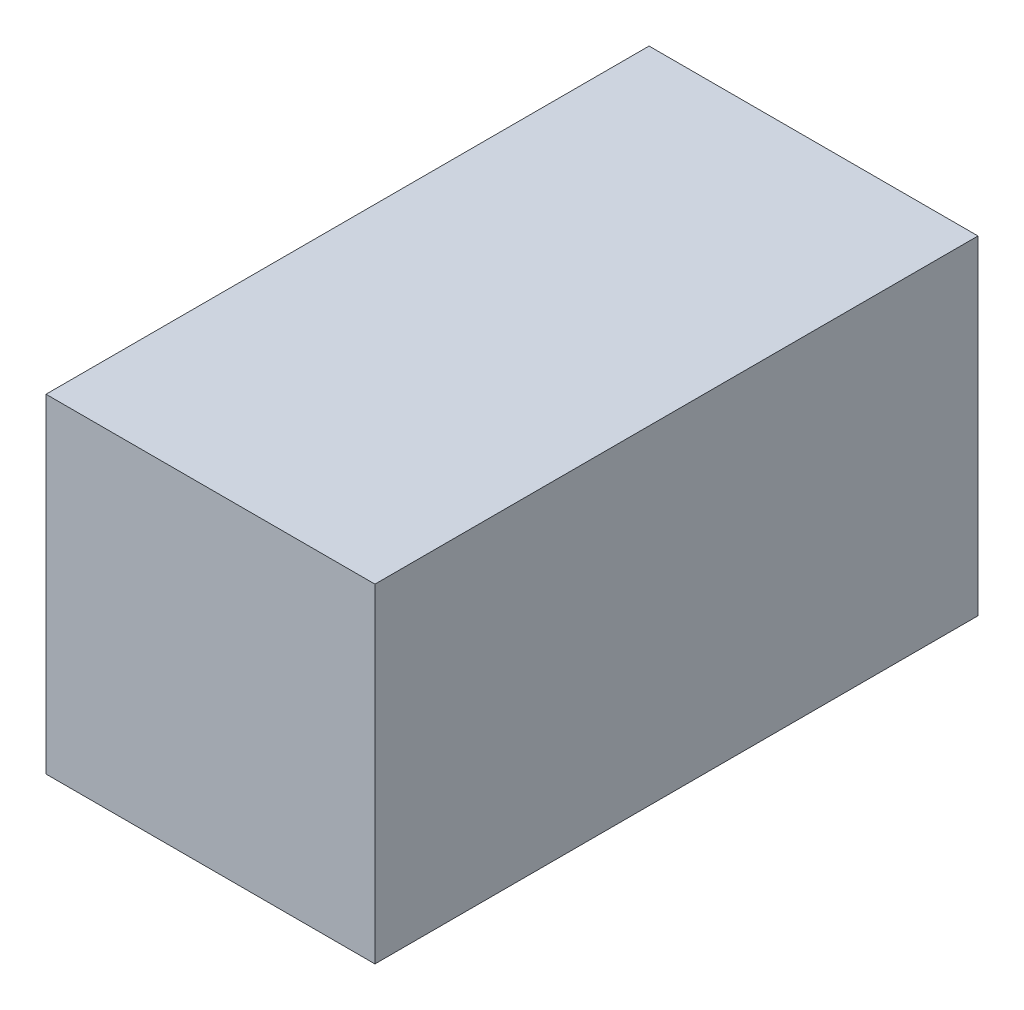
ISO-10303-21;
HEADER;
FILE_DESCRIPTION(('STEP AP214'),'2;1');
FILE_NAME('part.step','',(''),(''),'','','');
FILE_SCHEMA(('AUTOMOTIVE_DESIGN { 1 0 10303 214 1 1 1 1 }'));
ENDSEC;
DATA;
#1=APPLICATION_CONTEXT('core data for automotive mechanical design processes');
#2=APPLICATION_PROTOCOL_DEFINITION('international standard','automotive_design',2000,#1);
#3=PRODUCT_CONTEXT('',#1,'mechanical');
#4=PRODUCT('Part','Part','',(#3));
#5=PRODUCT_RELATED_PRODUCT_CATEGORY('part','',(#4));
#6=PRODUCT_DEFINITION_FORMATION('','',#4);
#7=PRODUCT_DEFINITION_CONTEXT('part definition',#1,'design');
#8=PRODUCT_DEFINITION('design','',#6,#7);
#9=PRODUCT_DEFINITION_SHAPE('','',#8);
#10=(LENGTH_UNIT() NAMED_UNIT(*) SI_UNIT(.MILLI.,.METRE.));
#11=(NAMED_UNIT(*) PLANE_ANGLE_UNIT() SI_UNIT($,.RADIAN.));
#12=(NAMED_UNIT(*) SI_UNIT($,.STERADIAN.) SOLID_ANGLE_UNIT());
#13=UNCERTAINTY_MEASURE_WITH_UNIT(LENGTH_MEASURE(1.E-05),#10,'distance_accuracy_value','');
#14=(GEOMETRIC_REPRESENTATION_CONTEXT(3) GLOBAL_UNCERTAINTY_ASSIGNED_CONTEXT((#13)) GLOBAL_UNIT_ASSIGNED_CONTEXT((#10,
#11,#12)) REPRESENTATION_CONTEXT('',''));
#15=CARTESIAN_POINT('',(0.,0.,0.));
#16=DIRECTION('',(0.,0.,1.));
#17=DIRECTION('',(1.,0.,0.));
#18=AXIS2_PLACEMENT_3D('',#15,#16,#17);
#19=CARTESIAN_POINT('',(0.,0.,139.7));
#20=DIRECTION('',(1.,0.,0.));
#21=DIRECTION('',(0.,0.,-1.));
#22=AXIS2_PLACEMENT_3D('',#19,#20,#21);
#23=PLANE('',#22);
#24=DIRECTION('',(0.,-1.,0.));
#25=VECTOR('',#24,1.);
#26=CARTESIAN_POINT('',(0.,0.,0.));
#27=LINE('',#26,#25);
#28=CARTESIAN_POINT('',(0.,76.2,0.));
#29=VERTEX_POINT('',#28);
#30=CARTESIAN_POINT('',(0.,0.,0.));
#31=VERTEX_POINT('',#30);
#32=EDGE_CURVE('E100',#29,#31,#27,.T.);
#33=ORIENTED_EDGE('',*,*,#32,.T.);
#34=DIRECTION('',(0.,0.,-1.));
#35=VECTOR('',#34,1.);
#36=CARTESIAN_POINT('',(0.,0.,139.7));
#37=LINE('',#36,#35);
#38=CARTESIAN_POINT('',(0.,0.,139.7));
#39=VERTEX_POINT('',#38);
#40=EDGE_CURVE('E11',#39,#31,#37,.T.);
#41=ORIENTED_EDGE('',*,*,#40,.F.);
#42=DIRECTION('',(0.,-1.,0.));
#43=VECTOR('',#42,1.);
#44=CARTESIAN_POINT('',(0.,0.,139.7));
#45=LINE('',#44,#43);
#46=CARTESIAN_POINT('',(0.,76.2,139.7));
#47=VERTEX_POINT('',#46);
#48=EDGE_CURVE('E88',#47,#39,#45,.T.);
#49=ORIENTED_EDGE('',*,*,#48,.F.);
#50=DIRECTION('',(0.,0.,-1.));
#51=VECTOR('',#50,1.);
#52=CARTESIAN_POINT('',(0.,76.2,139.7));
#53=LINE('',#52,#51);
#54=EDGE_CURVE('E96',#47,#29,#53,.T.);
#55=ORIENTED_EDGE('',*,*,#54,.T.);
#56=EDGE_LOOP('',(#33,#41,#49,#55));
#57=FACE_BOUND('',#56,.T.);
#58=ADVANCED_FACE('F37',(#57),#23,.F.);
#59=CARTESIAN_POINT('',(0.,0.,139.7));
#60=DIRECTION('',(0.,1.,0.));
#61=DIRECTION('',(0.,0.,1.));
#62=AXIS2_PLACEMENT_3D('',#59,#60,#61);
#63=PLANE('',#62);
#64=DIRECTION('',(1.,0.,0.));
#65=VECTOR('',#64,1.);
#66=CARTESIAN_POINT('',(0.,0.,0.));
#67=LINE('',#66,#65);
#68=CARTESIAN_POINT('',(76.2,0.,0.));
#69=VERTEX_POINT('',#68);
#70=EDGE_CURVE('E92',#31,#69,#67,.T.);
#71=ORIENTED_EDGE('',*,*,#70,.T.);
#72=DIRECTION('',(0.,0.,-1.));
#73=VECTOR('',#72,1.);
#74=CARTESIAN_POINT('',(76.2,0.,139.7));
#75=LINE('',#74,#73);
#76=CARTESIAN_POINT('',(76.2,0.,139.7));
#77=VERTEX_POINT('',#76);
#78=EDGE_CURVE('E45',#77,#69,#75,.T.);
#79=ORIENTED_EDGE('',*,*,#78,.F.);
#80=DIRECTION('',(1.,0.,0.));
#81=VECTOR('',#80,1.);
#82=CARTESIAN_POINT('',(0.,0.,139.7));
#83=LINE('',#82,#81);
#84=EDGE_CURVE('E83',#39,#77,#83,.T.);
#85=ORIENTED_EDGE('',*,*,#84,.F.);
#86=ORIENTED_EDGE('',*,*,#40,.T.);
#87=EDGE_LOOP('',(#71,#79,#85,#86));
#88=FACE_BOUND('',#87,.T.);
#89=ADVANCED_FACE('F91',(#88),#63,.F.);
#90=CARTESIAN_POINT('',(76.2,0.,139.7));
#91=DIRECTION('',(-1.,0.,0.));
#92=DIRECTION('',(0.,0.,1.));
#93=AXIS2_PLACEMENT_3D('',#90,#91,#92);
#94=PLANE('',#93);
#95=DIRECTION('',(0.,1.,0.));
#96=VECTOR('',#95,1.);
#97=CARTESIAN_POINT('',(76.2,0.,0.));
#98=LINE('',#97,#96);
#99=CARTESIAN_POINT('',(76.2,76.2,0.));
#100=VERTEX_POINT('',#99);
#101=EDGE_CURVE('E70',#69,#100,#98,.T.);
#102=ORIENTED_EDGE('',*,*,#101,.T.);
#103=DIRECTION('',(0.,0.,-1.));
#104=VECTOR('',#103,1.);
#105=CARTESIAN_POINT('',(76.2,76.2,139.7));
#106=LINE('',#105,#104);
#107=CARTESIAN_POINT('',(76.2,76.2,139.7));
#108=VERTEX_POINT('',#107);
#109=EDGE_CURVE('E93',#108,#100,#106,.T.);
#110=ORIENTED_EDGE('',*,*,#109,.F.);
#111=DIRECTION('',(0.,1.,0.));
#112=VECTOR('',#111,1.);
#113=CARTESIAN_POINT('',(76.2,0.,139.7));
#114=LINE('',#113,#112);
#115=EDGE_CURVE('E86',#77,#108,#114,.T.);
#116=ORIENTED_EDGE('',*,*,#115,.F.);
#117=ORIENTED_EDGE('',*,*,#78,.T.);
#118=EDGE_LOOP('',(#102,#110,#116,#117));
#119=FACE_BOUND('',#118,.T.);
#120=ADVANCED_FACE('F94',(#119),#94,.F.);
#121=CARTESIAN_POINT('',(0.,76.2,139.7));
#122=DIRECTION('',(0.,-1.,0.));
#123=DIRECTION('',(0.,0.,-1.));
#124=AXIS2_PLACEMENT_3D('',#121,#122,#123);
#125=PLANE('',#124);
#126=DIRECTION('',(-1.,0.,0.));
#127=VECTOR('',#126,1.);
#128=CARTESIAN_POINT('',(0.,76.2,0.));
#129=LINE('',#128,#127);
#130=EDGE_CURVE('E76',#100,#29,#129,.T.);
#131=ORIENTED_EDGE('',*,*,#130,.T.);
#132=ORIENTED_EDGE('',*,*,#54,.F.);
#133=DIRECTION('',(-1.,0.,0.));
#134=VECTOR('',#133,1.);
#135=CARTESIAN_POINT('',(0.,76.2,139.7));
#136=LINE('',#135,#134);
#137=EDGE_CURVE('E53',#108,#47,#136,.T.);
#138=ORIENTED_EDGE('',*,*,#137,.F.);
#139=ORIENTED_EDGE('',*,*,#109,.T.);
#140=EDGE_LOOP('',(#131,#132,#138,#139));
#141=FACE_BOUND('',#140,.T.);
#142=ADVANCED_FACE('F107',(#141),#125,.F.);
#143=CARTESIAN_POINT('',(0.,0.,139.7));
#144=DIRECTION('',(0.,0.,-1.));
#145=DIRECTION('',(-1.,0.,0.));
#146=AXIS2_PLACEMENT_3D('',#143,#144,#145);
#147=PLANE('',#146);
#148=ORIENTED_EDGE('',*,*,#48,.T.);
#149=ORIENTED_EDGE('',*,*,#84,.T.);
#150=ORIENTED_EDGE('',*,*,#115,.T.);
#151=ORIENTED_EDGE('',*,*,#137,.T.);
#152=EDGE_LOOP('',(#148,#149,#150,#151));
#153=FACE_BOUND('',#152,.T.);
#154=ADVANCED_FACE('F84',(#153),#147,.F.);
#155=CARTESIAN_POINT('',(0.,0.,0.));
#156=DIRECTION('',(0.,0.,-1.));
#157=DIRECTION('',(-1.,0.,0.));
#158=AXIS2_PLACEMENT_3D('',#155,#156,#157);
#159=PLANE('',#158);
#160=ORIENTED_EDGE('',*,*,#32,.F.);
#161=ORIENTED_EDGE('',*,*,#130,.F.);
#162=ORIENTED_EDGE('',*,*,#101,.F.);
#163=ORIENTED_EDGE('',*,*,#70,.F.);
#164=EDGE_LOOP('',(#160,#161,#162,#163));
#165=FACE_BOUND('',#164,.T.);
#166=ADVANCED_FACE('F110',(#165),#159,.T.);
#167=CLOSED_SHELL('',(#58,#89,#120,#142,#154,#166));
#168=MANIFOLD_SOLID_BREP('B2',#167);
#169=ADVANCED_BREP_SHAPE_REPRESENTATION('',(#18,#168),#14);
#170=SHAPE_DEFINITION_REPRESENTATION(#9,#169);
ENDSEC;
END-ISO-10303-21;
